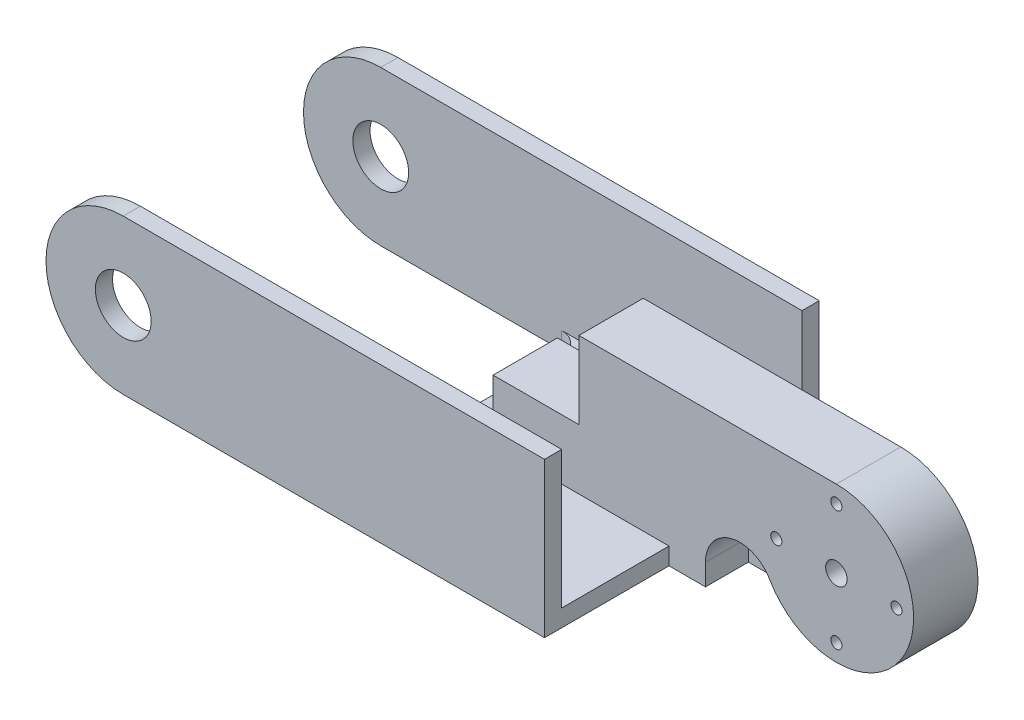
ISO-10303-21;
HEADER;
FILE_DESCRIPTION(('STEP AP214'),'2;1');
FILE_NAME('part.step','',(''),(''),'','','');
FILE_SCHEMA(('AUTOMOTIVE_DESIGN { 1 0 10303 214 1 1 1 1 }'));
ENDSEC;
DATA;
#1=APPLICATION_CONTEXT('core data for automotive mechanical design processes');
#2=APPLICATION_PROTOCOL_DEFINITION('international standard','automotive_design',2000,#1);
#3=PRODUCT_CONTEXT('',#1,'mechanical');
#4=PRODUCT('Part','Part','',(#3));
#5=PRODUCT_RELATED_PRODUCT_CATEGORY('part','',(#4));
#6=PRODUCT_DEFINITION_FORMATION('','',#4);
#7=PRODUCT_DEFINITION_CONTEXT('part definition',#1,'design');
#8=PRODUCT_DEFINITION('design','',#6,#7);
#9=PRODUCT_DEFINITION_SHAPE('','',#8);
#10=(LENGTH_UNIT() NAMED_UNIT(*) SI_UNIT(.MILLI.,.METRE.));
#11=(NAMED_UNIT(*) PLANE_ANGLE_UNIT() SI_UNIT($,.RADIAN.));
#12=(NAMED_UNIT(*) SI_UNIT($,.STERADIAN.) SOLID_ANGLE_UNIT());
#13=UNCERTAINTY_MEASURE_WITH_UNIT(LENGTH_MEASURE(1.E-05),#10,'distance_accuracy_value','');
#14=(GEOMETRIC_REPRESENTATION_CONTEXT(3) GLOBAL_UNCERTAINTY_ASSIGNED_CONTEXT((#13)) GLOBAL_UNIT_ASSIGNED_CONTEXT((#10,
#11,#12)) REPRESENTATION_CONTEXT('',''));
#15=CARTESIAN_POINT('',(0.,0.,0.));
#16=DIRECTION('',(0.,0.,1.));
#17=DIRECTION('',(1.,0.,0.));
#18=AXIS2_PLACEMENT_3D('',#15,#16,#17);
#19=CARTESIAN_POINT('',(0.,0.,4.));
#20=DIRECTION('',(-1.,0.,0.));
#21=DIRECTION('',(0.,0.,1.));
#22=AXIS2_PLACEMENT_3D('',#19,#20,#21);
#23=PLANE('',#22);
#24=DIRECTION('',(0.,1.,0.));
#25=VECTOR('',#24,1.);
#26=CARTESIAN_POINT('',(0.,0.,0.));
#27=LINE('',#26,#25);
#28=CARTESIAN_POINT('',(0.,0.,0.));
#29=VERTEX_POINT('',#28);
#30=CARTESIAN_POINT('',(0.,36.,0.));
#31=VERTEX_POINT('',#30);
#32=EDGE_CURVE('E473',#29,#31,#27,.T.);
#33=ORIENTED_EDGE('',*,*,#32,.T.);
#34=DIRECTION('',(0.,0.,-1.));
#35=VECTOR('',#34,1.);
#36=CARTESIAN_POINT('',(0.,36.,4.));
#37=LINE('',#36,#35);
#38=CARTESIAN_POINT('',(0.,36.,4.));
#39=VERTEX_POINT('',#38);
#40=EDGE_CURVE('E510',#39,#31,#37,.T.);
#41=ORIENTED_EDGE('',*,*,#40,.F.);
#42=DIRECTION('',(0.,1.,0.));
#43=VECTOR('',#42,1.);
#44=CARTESIAN_POINT('',(0.,0.,4.));
#45=LINE('',#44,#43);
#46=CARTESIAN_POINT('',(0.,4.,4.));
#47=VERTEX_POINT('',#46);
#48=EDGE_CURVE('E474',#47,#39,#45,.T.);
#49=ORIENTED_EDGE('',*,*,#48,.F.);
#50=DIRECTION('',(0.,0.,-1.));
#51=VECTOR('',#50,1.);
#52=CARTESIAN_POINT('',(0.,4.,20.));
#53=LINE('',#52,#51);
#54=CARTESIAN_POINT('',(0.,4.,20.));
#55=VERTEX_POINT('',#54);
#56=EDGE_CURVE('E470',#55,#47,#53,.T.);
#57=ORIENTED_EDGE('',*,*,#56,.F.);
#58=DIRECTION('',(0.,1.,0.));
#59=VECTOR('',#58,1.);
#60=CARTESIAN_POINT('',(0.,0.,20.));
#61=LINE('',#60,#59);
#62=CARTESIAN_POINT('',(0.,0.,20.));
#63=VERTEX_POINT('',#62);
#64=EDGE_CURVE('E450',#63,#55,#61,.T.);
#65=ORIENTED_EDGE('',*,*,#64,.F.);
#66=DIRECTION('',(0.,0.,-1.));
#67=VECTOR('',#66,1.);
#68=CARTESIAN_POINT('',(0.,0.,4.));
#69=LINE('',#68,#67);
#70=EDGE_CURVE('E487',#63,#29,#69,.T.);
#71=ORIENTED_EDGE('',*,*,#70,.T.);
#72=EDGE_LOOP('',(#33,#41,#49,#57,#65,#71));
#73=FACE_BOUND('',#72,.T.);
#74=ADVANCED_FACE('F50',(#73),#23,.F.);
#75=CARTESIAN_POINT('',(0.,36.,4.));
#76=DIRECTION('',(0.,-1.,0.));
#77=DIRECTION('',(0.,0.,-1.));
#78=AXIS2_PLACEMENT_3D('',#75,#76,#77);
#79=PLANE('',#78);
#80=DIRECTION('',(-1.,0.,0.));
#81=VECTOR('',#80,1.);
#82=CARTESIAN_POINT('',(0.,36.,0.));
#83=LINE('',#82,#81);
#84=CARTESIAN_POINT('',(-98.17,36.,0.));
#85=VERTEX_POINT('',#84);
#86=EDGE_CURVE('E491',#31,#85,#83,.T.);
#87=ORIENTED_EDGE('',*,*,#86,.T.);
#88=DIRECTION('',(0.,0.,-1.));
#89=VECTOR('',#88,1.);
#90=CARTESIAN_POINT('',(-98.17,36.,4.));
#91=LINE('',#90,#89);
#92=CARTESIAN_POINT('',(-98.17,36.,4.));
#93=VERTEX_POINT('',#92);
#94=EDGE_CURVE('E506',#93,#85,#91,.T.);
#95=ORIENTED_EDGE('',*,*,#94,.F.);
#96=DIRECTION('',(-1.,0.,0.));
#97=VECTOR('',#96,1.);
#98=CARTESIAN_POINT('',(0.,36.,4.));
#99=LINE('',#98,#97);
#100=EDGE_CURVE('E477',#39,#93,#99,.T.);
#101=ORIENTED_EDGE('',*,*,#100,.F.);
#102=ORIENTED_EDGE('',*,*,#40,.T.);
#103=EDGE_LOOP('',(#87,#95,#101,#102));
#104=FACE_BOUND('',#103,.T.);
#105=ADVANCED_FACE('F628',(#104),#79,.F.);
#106=CARTESIAN_POINT('',(-98.17,18.,4.));
#107=DIRECTION('',(0.,0.,-1.));
#108=DIRECTION('',(-1.,0.,0.));
#109=AXIS2_PLACEMENT_3D('',#106,#107,#108);
#110=CYLINDRICAL_SURFACE('',#109,18.);
#111=CARTESIAN_POINT('',(-98.17,18.,0.));
#112=DIRECTION('',(0.,0.,1.));
#113=DIRECTION('',(1.,0.,0.));
#114=AXIS2_PLACEMENT_3D('',#111,#112,#113);
#115=CIRCLE('',#114,18.);
#116=CARTESIAN_POINT('',(-98.17,0.,0.));
#117=VERTEX_POINT('',#116);
#118=EDGE_CURVE('E494',#85,#117,#115,.T.);
#119=ORIENTED_EDGE('',*,*,#118,.T.);
#120=DIRECTION('',(0.,0.,-1.));
#121=VECTOR('',#120,1.);
#122=CARTESIAN_POINT('',(-98.17,0.,4.));
#123=LINE('',#122,#121);
#124=CARTESIAN_POINT('',(-98.17,0.,4.));
#125=VERTEX_POINT('',#124);
#126=EDGE_CURVE('E502',#125,#117,#123,.T.);
#127=ORIENTED_EDGE('',*,*,#126,.F.);
#128=CARTESIAN_POINT('',(-98.17,18.,4.));
#129=DIRECTION('',(0.,0.,1.));
#130=DIRECTION('',(1.,0.,0.));
#131=AXIS2_PLACEMENT_3D('',#128,#129,#130);
#132=CIRCLE('',#131,18.);
#133=EDGE_CURVE('E481',#93,#125,#132,.T.);
#134=ORIENTED_EDGE('',*,*,#133,.F.);
#135=ORIENTED_EDGE('',*,*,#94,.T.);
#136=EDGE_LOOP('',(#119,#127,#134,#135));
#137=FACE_BOUND('',#136,.T.);
#138=ADVANCED_FACE('F633',(#137),#110,.T.);
#139=CARTESIAN_POINT('',(0.,0.,4.));
#140=DIRECTION('',(0.,1.,0.));
#141=DIRECTION('',(0.,0.,1.));
#142=AXIS2_PLACEMENT_3D('',#139,#140,#141);
#143=PLANE('',#142);
#144=DIRECTION('',(1.,0.,0.));
#145=VECTOR('',#144,1.);
#146=CARTESIAN_POINT('',(0.,0.,0.));
#147=LINE('',#146,#145);
#148=EDGE_CURVE('E478',#117,#29,#147,.T.);
#149=ORIENTED_EDGE('',*,*,#148,.T.);
#150=ORIENTED_EDGE('',*,*,#70,.F.);
#151=DIRECTION('',(1.,0.,0.));
#152=VECTOR('',#151,1.);
#153=CARTESIAN_POINT('',(0.,0.,20.));
#154=LINE('',#153,#152);
#155=CARTESIAN_POINT('',(-51.,0.,20.));
#156=VERTEX_POINT('',#155);
#157=EDGE_CURVE('E457',#156,#63,#154,.T.);
#158=ORIENTED_EDGE('',*,*,#157,.F.);
#159=DIRECTION('',(0.,0.,-1.));
#160=VECTOR('',#159,1.);
#161=CARTESIAN_POINT('',(-51.,0.,20.));
#162=LINE('',#161,#160);
#163=CARTESIAN_POINT('',(-51.,0.,9.));
#164=VERTEX_POINT('',#163);
#165=EDGE_CURVE('E461',#156,#164,#162,.T.);
#166=ORIENTED_EDGE('',*,*,#165,.T.);
#167=CARTESIAN_POINT('',(-56.,0.,9.));
#168=DIRECTION('',(0.,1.,0.));
#169=DIRECTION('',(0.,0.,1.));
#170=AXIS2_PLACEMENT_3D('',#167,#168,#169);
#171=CIRCLE('',#170,5.);
#172=CARTESIAN_POINT('',(-56.,0.,4.));
#173=VERTEX_POINT('',#172);
#174=EDGE_CURVE('E59',#164,#173,#171,.T.);
#175=ORIENTED_EDGE('',*,*,#174,.T.);
#176=DIRECTION('',(1.,0.,0.));
#177=VECTOR('',#176,1.);
#178=CARTESIAN_POINT('',(0.,0.,4.));
#179=LINE('',#178,#177);
#180=EDGE_CURVE('E484',#125,#173,#179,.T.);
#181=ORIENTED_EDGE('',*,*,#180,.F.);
#182=ORIENTED_EDGE('',*,*,#126,.T.);
#183=EDGE_LOOP('',(#149,#150,#158,#166,#175,#181,#182));
#184=FACE_BOUND('',#183,.T.);
#185=ADVANCED_FACE('F602',(#184),#143,.F.);
#186=CARTESIAN_POINT('',(-98.17,18.,4.));
#187=DIRECTION('',(0.,0.,1.));
#188=DIRECTION('',(1.,0.,0.));
#189=AXIS2_PLACEMENT_3D('',#186,#187,#188);
#190=PLANE('',#189);
#191=CARTESIAN_POINT('',(-98.17,18.,4.));
#192=DIRECTION('',(0.,0.,1.));
#193=DIRECTION('',(1.,0.,0.));
#194=AXIS2_PLACEMENT_3D('',#191,#192,#193);
#195=CIRCLE('',#194,6.5);
#196=CARTESIAN_POINT('',(-91.67,18.,4.));
#197=VERTEX_POINT('',#196);
#198=EDGE_CURVE('E318',#197,#197,#195,.T.);
#199=ORIENTED_EDGE('',*,*,#198,.F.);
#200=EDGE_LOOP('',(#199));
#201=FACE_BOUND('',#200,.T.);
#202=ORIENTED_EDGE('',*,*,#180,.T.);
#203=DIRECTION('',(0.,-1.,0.));
#204=VECTOR('',#203,1.);
#205=CARTESIAN_POINT('',(-56.,18.,4.));
#206=LINE('',#205,#204);
#207=CARTESIAN_POINT('',(-56.,4.,4.));
#208=VERTEX_POINT('',#207);
#209=EDGE_CURVE('E525',#173,#208,#206,.F.);
#210=ORIENTED_EDGE('',*,*,#209,.T.);
#211=DIRECTION('',(-1.,0.,0.));
#212=VECTOR('',#211,1.);
#213=CARTESIAN_POINT('',(0.,4.,4.));
#214=LINE('',#213,#212);
#215=EDGE_CURVE('E65',#47,#208,#214,.T.);
#216=ORIENTED_EDGE('',*,*,#215,.F.);
#217=ORIENTED_EDGE('',*,*,#48,.T.);
#218=ORIENTED_EDGE('',*,*,#100,.T.);
#219=ORIENTED_EDGE('',*,*,#133,.T.);
#220=EDGE_LOOP('',(#202,#210,#216,#217,#218,#219));
#221=FACE_BOUND('',#220,.T.);
#222=ADVANCED_FACE('F725',(#201,#221),#190,.T.);
#223=CARTESIAN_POINT('',(-98.17,18.,0.));
#224=DIRECTION('',(0.,0.,1.));
#225=DIRECTION('',(1.,0.,0.));
#226=AXIS2_PLACEMENT_3D('',#223,#224,#225);
#227=PLANE('',#226);
#228=CARTESIAN_POINT('',(-98.17,18.,0.));
#229=DIRECTION('',(0.,0.,1.));
#230=DIRECTION('',(1.,0.,0.));
#231=AXIS2_PLACEMENT_3D('',#228,#229,#230);
#232=CIRCLE('',#231,6.5);
#233=CARTESIAN_POINT('',(-91.67,18.,0.));
#234=VERTEX_POINT('',#233);
#235=EDGE_CURVE('E307',#234,#234,#232,.T.);
#236=ORIENTED_EDGE('',*,*,#235,.T.);
#237=EDGE_LOOP('',(#236));
#238=FACE_BOUND('',#237,.T.);
#239=ORIENTED_EDGE('',*,*,#32,.F.);
#240=ORIENTED_EDGE('',*,*,#148,.F.);
#241=ORIENTED_EDGE('',*,*,#118,.F.);
#242=ORIENTED_EDGE('',*,*,#86,.F.);
#243=EDGE_LOOP('',(#239,#240,#241,#242));
#244=FACE_BOUND('',#243,.T.);
#245=ADVANCED_FACE('F721',(#238,#244),#227,.F.);
#246=CARTESIAN_POINT('',(0.,4.,20.));
#247=DIRECTION('',(0.,-1.,0.));
#248=DIRECTION('',(0.,0.,-1.));
#249=AXIS2_PLACEMENT_3D('',#246,#247,#248);
#250=PLANE('',#249);
#251=ORIENTED_EDGE('',*,*,#215,.T.);
#252=CARTESIAN_POINT('',(-56.,4.,9.));
#253=DIRECTION('',(0.,-1.,0.));
#254=DIRECTION('',(0.,0.,-1.));
#255=AXIS2_PLACEMENT_3D('',#252,#253,#254);
#256=CIRCLE('',#255,5.);
#257=CARTESIAN_POINT('',(-51.,4.,9.));
#258=VERTEX_POINT('',#257);
#259=EDGE_CURVE('E11',#208,#258,#256,.T.);
#260=ORIENTED_EDGE('',*,*,#259,.T.);
#261=DIRECTION('',(0.,0.,-1.));
#262=VECTOR('',#261,1.);
#263=CARTESIAN_POINT('',(-51.,4.,20.));
#264=LINE('',#263,#262);
#265=CARTESIAN_POINT('',(-51.,4.,55.));
#266=VERTEX_POINT('',#265);
#267=EDGE_CURVE('E466',#266,#258,#264,.T.);
#268=ORIENTED_EDGE('',*,*,#267,.F.);
#269=CARTESIAN_POINT('',(-56.,4.,55.));
#270=DIRECTION('',(0.,-1.,0.));
#271=DIRECTION('',(0.,0.,-1.));
#272=AXIS2_PLACEMENT_3D('',#269,#270,#271);
#273=CIRCLE('',#272,5.);
#274=CARTESIAN_POINT('',(-56.,4.,60.));
#275=VERTEX_POINT('',#274);
#276=EDGE_CURVE('E531',#266,#275,#273,.T.);
#277=ORIENTED_EDGE('',*,*,#276,.T.);
#278=DIRECTION('',(-1.,0.,0.));
#279=VECTOR('',#278,1.);
#280=CARTESIAN_POINT('',(0.,4.,60.));
#281=LINE('',#280,#279);
#282=CARTESIAN_POINT('',(0.,4.,60.));
#283=VERTEX_POINT('',#282);
#284=EDGE_CURVE('E362',#283,#275,#281,.T.);
#285=ORIENTED_EDGE('',*,*,#284,.F.);
#286=DIRECTION('',(0.,0.,-1.));
#287=VECTOR('',#286,1.);
#288=CARTESIAN_POINT('',(0.,4.,60.));
#289=LINE('',#288,#287);
#290=CARTESIAN_POINT('',(0.,4.,35.));
#291=VERTEX_POINT('',#290);
#292=EDGE_CURVE('E376',#283,#291,#289,.T.);
#293=ORIENTED_EDGE('',*,*,#292,.T.);
#294=DIRECTION('',(-1.,0.,0.));
#295=VECTOR('',#294,1.);
#296=CARTESIAN_POINT('',(0.,4.,35.));
#297=LINE('',#296,#295);
#298=CARTESIAN_POINT('',(-41.,4.,35.));
#299=VERTEX_POINT('',#298);
#300=EDGE_CURVE('E366',#291,#299,#297,.T.);
#301=ORIENTED_EDGE('',*,*,#300,.T.);
#302=DIRECTION('',(0.,0.,-1.));
#303=VECTOR('',#302,1.);
#304=CARTESIAN_POINT('',(-41.,4.,35.));
#305=LINE('',#304,#303);
#306=CARTESIAN_POINT('',(-41.,4.,20.));
#307=VERTEX_POINT('',#306);
#308=EDGE_CURVE('E446',#299,#307,#305,.T.);
#309=ORIENTED_EDGE('',*,*,#308,.T.);
#310=DIRECTION('',(-1.,0.,0.));
#311=VECTOR('',#310,1.);
#312=CARTESIAN_POINT('',(0.,4.,20.));
#313=LINE('',#312,#311);
#314=EDGE_CURVE('E454',#55,#307,#313,.T.);
#315=ORIENTED_EDGE('',*,*,#314,.F.);
#316=ORIENTED_EDGE('',*,*,#56,.T.);
#317=EDGE_LOOP('',(#251,#260,#268,#277,#285,#293,#301,#309,#315,#316));
#318=FACE_BOUND('',#317,.T.);
#319=ADVANCED_FACE('F610',(#318),#250,.F.);
#320=CARTESIAN_POINT('',(-51.,0.,20.));
#321=DIRECTION('',(1.,0.,0.));
#322=DIRECTION('',(0.,0.,-1.));
#323=AXIS2_PLACEMENT_3D('',#320,#321,#322);
#324=PLANE('',#323);
#325=DIRECTION('',(0.,0.,-1.));
#326=VECTOR('',#325,1.);
#327=CARTESIAN_POINT('',(-51.,0.,35.));
#328=LINE('',#327,#326);
#329=CARTESIAN_POINT('',(-51.,0.,55.));
#330=VERTEX_POINT('',#329);
#331=EDGE_CURVE('E443',#330,#156,#328,.T.);
#332=ORIENTED_EDGE('',*,*,#331,.F.);
#333=DIRECTION('',(0.,-1.,0.));
#334=VECTOR('',#333,1.);
#335=CARTESIAN_POINT('',(-51.,4.,55.));
#336=LINE('',#335,#334);
#337=EDGE_CURVE('E522',#330,#266,#336,.F.);
#338=ORIENTED_EDGE('',*,*,#337,.T.);
#339=ORIENTED_EDGE('',*,*,#267,.T.);
#340=DIRECTION('',(0.,-1.,0.));
#341=VECTOR('',#340,1.);
#342=CARTESIAN_POINT('',(-51.,0.,9.));
#343=LINE('',#342,#341);
#344=EDGE_CURVE('E518',#258,#164,#343,.T.);
#345=ORIENTED_EDGE('',*,*,#344,.T.);
#346=ORIENTED_EDGE('',*,*,#165,.F.);
#347=EDGE_LOOP('',(#332,#338,#339,#345,#346));
#348=FACE_BOUND('',#347,.T.);
#349=ADVANCED_FACE('F599',(#348),#324,.F.);
#350=CARTESIAN_POINT('',(0.,0.,20.));
#351=DIRECTION('',(0.,0.,1.));
#352=DIRECTION('',(1.,0.,0.));
#353=AXIS2_PLACEMENT_3D('',#350,#351,#352);
#354=PLANE('',#353);
#355=CARTESIAN_POINT('',(39.,18.,20.));
#356=DIRECTION('',(0.,0.,1.));
#357=DIRECTION('',(1.,0.,0.));
#358=AXIS2_PLACEMENT_3D('',#355,#356,#357);
#359=CIRCLE('',#358,2.5);
#360=CARTESIAN_POINT('',(41.5,18.,20.));
#361=VERTEX_POINT('',#360);
#362=EDGE_CURVE('E302',#361,#361,#359,.T.);
#363=ORIENTED_EDGE('',*,*,#362,.T.);
#364=EDGE_LOOP('',(#363));
#365=FACE_BOUND('',#364,.T.);
#366=DIRECTION('',(0.999999999999998,6.85427510763005E-08,0.));
#367=VECTOR('',#366,1.);
#368=CARTESIAN_POINT('',(-2.40326847280963E-13,3.50623287666751E-06,20.));
#369=LINE('',#368,#367);
#370=CARTESIAN_POINT('',(39.0000000000002,6.17940016864327E-06,20.));
#371=VERTEX_POINT('',#370);
#372=EDGE_CURVE('E408',#63,#371,#369,.T.);
#373=ORIENTED_EDGE('',*,*,#372,.F.);
#374=ORIENTED_EDGE('',*,*,#64,.T.);
#375=ORIENTED_EDGE('',*,*,#314,.T.);
#376=DIRECTION('',(0.,1.,0.));
#377=VECTOR('',#376,1.);
#378=CARTESIAN_POINT('',(-41.,0.,20.));
#379=LINE('',#378,#377);
#380=CARTESIAN_POINT('',(-41.,18.0000000105526,20.));
#381=VERTEX_POINT('',#380);
#382=EDGE_CURVE('E380',#307,#381,#379,.T.);
#383=ORIENTED_EDGE('',*,*,#382,.T.);
#384=DIRECTION('',(-1.,0.,0.));
#385=VECTOR('',#384,1.);
#386=CARTESIAN_POINT('',(0.,18.0000000105526,20.));
#387=LINE('',#386,#385);
#388=CARTESIAN_POINT('',(-21.,18.0000000105526,20.));
#389=VERTEX_POINT('',#388);
#390=EDGE_CURVE('E386',#389,#381,#387,.T.);
#391=ORIENTED_EDGE('',*,*,#390,.F.);
#392=DIRECTION('',(0.,1.,0.));
#393=VECTOR('',#392,1.);
#394=CARTESIAN_POINT('',(-21.,0.,20.));
#395=LINE('',#394,#393);
#396=CARTESIAN_POINT('',(-21.,36.000000010551,20.));
#397=VERTEX_POINT('',#396);
#398=EDGE_CURVE('E420',#389,#397,#395,.T.);
#399=ORIENTED_EDGE('',*,*,#398,.T.);
#400=DIRECTION('',(0.999999999999995,-1.03165851154048E-07,0.));
#401=VECTOR('',#400,1.);
#402=CARTESIAN_POINT('',(3.71397041912716E-06,35.9999978440677,20.));
#403=LINE('',#402,#401);
#404=CARTESIAN_POINT('',(39.0000028568994,35.9999938205996,20.));
#405=VERTEX_POINT('',#404);
#406=EDGE_CURVE('E416',#397,#405,#403,.T.);
#407=ORIENTED_EDGE('',*,*,#406,.T.);
#408=CARTESIAN_POINT('',(39.,18.,20.));
#409=DIRECTION('',(0.,0.,1.));
#410=DIRECTION('',(1.,0.,0.));
#411=AXIS2_PLACEMENT_3D('',#408,#409,#410);
#412=CIRCLE('',#411,17.9999938205998);
#413=EDGE_CURVE('E412',#371,#405,#412,.T.);
#414=ORIENTED_EDGE('',*,*,#413,.F.);
#415=EDGE_LOOP('',(#373,#374,#375,#383,#391,#399,#407,#414));
#416=FACE_BOUND('',#415,.T.);
#417=ADVANCED_FACE('F548',(#365,#416),#354,.F.);
#418=CARTESIAN_POINT('',(-41.,0.,35.));
#419=DIRECTION('',(-1.,0.,0.));
#420=DIRECTION('',(0.,0.,1.));
#421=AXIS2_PLACEMENT_3D('',#418,#419,#420);
#422=PLANE('',#421);
#423=ORIENTED_EDGE('',*,*,#382,.F.);
#424=ORIENTED_EDGE('',*,*,#308,.F.);
#425=DIRECTION('',(0.,1.,0.));
#426=VECTOR('',#425,1.);
#427=CARTESIAN_POINT('',(-41.,0.,35.));
#428=LINE('',#427,#426);
#429=CARTESIAN_POINT('',(-41.,18.0000000105526,35.));
#430=VERTEX_POINT('',#429);
#431=EDGE_CURVE('E381',#299,#430,#428,.T.);
#432=ORIENTED_EDGE('',*,*,#431,.T.);
#433=DIRECTION('',(0.,0.,-1.));
#434=VECTOR('',#433,1.);
#435=CARTESIAN_POINT('',(-41.,18.0000000105526,35.));
#436=LINE('',#435,#434);
#437=EDGE_CURVE('E404',#430,#381,#436,.T.);
#438=ORIENTED_EDGE('',*,*,#437,.T.);
#439=EDGE_LOOP('',(#423,#424,#432,#438));
#440=FACE_BOUND('',#439,.T.);
#441=ADVANCED_FACE('F612',(#440),#422,.T.);
#442=CARTESIAN_POINT('',(-2.40326847280963E-13,3.50623287666751E-06,35.));
#443=DIRECTION('',(-6.85427510763005E-08,0.999999999999998,0.));
#444=DIRECTION('',(-0.999999999999998,-6.85427510763005E-08,0.));
#445=AXIS2_PLACEMENT_3D('',#442,#443,#444);
#446=PLANE('',#445);
#447=DIRECTION('',(0.999999999999979,2.02594923104912E-07,0.));
#448=VECTOR('',#447,1.);
#449=CARTESIAN_POINT('',(8.49874126192618,0.,25.));
#450=LINE('',#449,#448);
#451=CARTESIAN_POINT('',(8.49874126192618,0.,25.));
#452=VERTEX_POINT('',#451);
#453=CARTESIAN_POINT('',(39.0000000000002,6.17940016864327E-06,25.));
#454=VERTEX_POINT('',#453);
#455=EDGE_CURVE('E272',#452,#454,#450,.T.);
#456=ORIENTED_EDGE('',*,*,#455,.F.);
#457=DIRECTION('',(0.,0.,1.));
#458=VECTOR('',#457,1.);
#459=CARTESIAN_POINT('',(8.49874126192618,0.,25.));
#460=LINE('',#459,#458);
#461=CARTESIAN_POINT('',(8.49874126192618,0.,35.));
#462=VERTEX_POINT('',#461);
#463=EDGE_CURVE('E292',#452,#462,#460,.T.);
#464=ORIENTED_EDGE('',*,*,#463,.T.);
#465=DIRECTION('',(0.999999999999998,6.85427510763005E-08,0.));
#466=VECTOR('',#465,1.);
#467=CARTESIAN_POINT('',(-2.40326847280963E-13,3.50623287666751E-06,35.));
#468=LINE('',#467,#466);
#469=CARTESIAN_POINT('',(0.,0.,35.));
#470=VERTEX_POINT('',#469);
#471=EDGE_CURVE('E385',#470,#462,#468,.T.);
#472=ORIENTED_EDGE('',*,*,#471,.F.);
#473=DIRECTION('',(0.,0.,-1.));
#474=VECTOR('',#473,1.);
#475=CARTESIAN_POINT('',(0.,0.,60.));
#476=LINE('',#475,#474);
#477=CARTESIAN_POINT('',(0.,0.,64.));
#478=VERTEX_POINT('',#477);
#479=EDGE_CURVE('E365',#478,#470,#476,.T.);
#480=ORIENTED_EDGE('',*,*,#479,.F.);
#481=DIRECTION('',(1.,0.,0.));
#482=VECTOR('',#481,1.);
#483=CARTESIAN_POINT('',(0.,0.,64.));
#484=LINE('',#483,#482);
#485=CARTESIAN_POINT('',(-98.17,0.,64.));
#486=VERTEX_POINT('',#485);
#487=EDGE_CURVE('E334',#486,#478,#484,.T.);
#488=ORIENTED_EDGE('',*,*,#487,.F.);
#489=DIRECTION('',(0.,0.,-1.));
#490=VECTOR('',#489,1.);
#491=CARTESIAN_POINT('',(-98.17,0.,64.));
#492=LINE('',#491,#490);
#493=CARTESIAN_POINT('',(-98.17,0.,60.));
#494=VERTEX_POINT('',#493);
#495=EDGE_CURVE('E338',#486,#494,#492,.T.);
#496=ORIENTED_EDGE('',*,*,#495,.T.);
#497=DIRECTION('',(1.,0.,0.));
#498=VECTOR('',#497,1.);
#499=CARTESIAN_POINT('',(0.,0.,60.));
#500=LINE('',#499,#498);
#501=CARTESIAN_POINT('',(-56.,0.,60.));
#502=VERTEX_POINT('',#501);
#503=EDGE_CURVE('E328',#494,#502,#500,.T.);
#504=ORIENTED_EDGE('',*,*,#503,.T.);
#505=CARTESIAN_POINT('',(-56.,-3.32161183974611E-07,55.));
#506=DIRECTION('',(-6.85427510763005E-08,0.999999999999998,0.));
#507=DIRECTION('',(-0.999999999999998,-6.85427510763005E-08,0.));
#508=AXIS2_PLACEMENT_3D('',#505,#506,#507);
#509=CIRCLE('',#508,5.);
#510=EDGE_CURVE('E528',#502,#330,#509,.T.);
#511=ORIENTED_EDGE('',*,*,#510,.T.);
#512=ORIENTED_EDGE('',*,*,#331,.T.);
#513=ORIENTED_EDGE('',*,*,#157,.T.);
#514=ORIENTED_EDGE('',*,*,#372,.T.);
#515=DIRECTION('',(0.,0.,-1.));
#516=VECTOR('',#515,1.);
#517=CARTESIAN_POINT('',(39.0000000000002,6.17940016864327E-06,35.));
#518=LINE('',#517,#516);
#519=EDGE_CURVE('E438',#454,#371,#518,.T.);
#520=ORIENTED_EDGE('',*,*,#519,.F.);
#521=EDGE_LOOP('',(#456,#464,#472,#480,#488,#496,#504,#511,#512,#513,#514,#520));
#522=FACE_BOUND('',#521,.T.);
#523=ADVANCED_FACE('F545',(#522),#446,.F.);
#524=CARTESIAN_POINT('',(39.,18.,35.));
#525=DIRECTION('',(0.,0.,-1.));
#526=DIRECTION('',(-1.,0.,0.));
#527=AXIS2_PLACEMENT_3D('',#524,#525,#526);
#528=CYLINDRICAL_SURFACE('',#527,17.9999938205998);
#529=ORIENTED_EDGE('',*,*,#413,.T.);
#530=DIRECTION('',(0.,0.,-1.));
#531=VECTOR('',#530,1.);
#532=CARTESIAN_POINT('',(39.0000028568994,35.9999938205996,35.));
#533=LINE('',#532,#531);
#534=CARTESIAN_POINT('',(39.0000028568994,35.9999938205996,35.));
#535=VERTEX_POINT('',#534);
#536=EDGE_CURVE('E435',#535,#405,#533,.T.);
#537=ORIENTED_EDGE('',*,*,#536,.F.);
#538=CARTESIAN_POINT('',(39.,18.,35.));
#539=DIRECTION('',(0.,0.,1.));
#540=DIRECTION('',(1.,0.,0.));
#541=AXIS2_PLACEMENT_3D('',#538,#539,#540);
#542=CIRCLE('',#541,17.9999938205998);
#543=CARTESIAN_POINT('',(39.0000000000002,6.17940016864327E-06,35.));
#544=VERTEX_POINT('',#543);
#545=EDGE_CURVE('E390',#544,#535,#542,.T.);
#546=ORIENTED_EDGE('',*,*,#545,.F.);
#547=EDGE_CURVE('E439',#544,#454,#518,.T.);
#548=ORIENTED_EDGE('',*,*,#547,.T.);
#549=ORIENTED_EDGE('',*,*,#519,.T.);
#550=EDGE_LOOP('',(#529,#537,#546,#548,#549));
#551=FACE_BOUND('',#550,.T.);
#552=ADVANCED_FACE('F538',(#551),#528,.T.);
#553=CARTESIAN_POINT('',(3.71397041912716E-06,35.9999978440677,35.));
#554=DIRECTION('',(1.03165851154048E-07,0.999999999999995,0.));
#555=DIRECTION('',(-0.999999999999995,1.03165851154048E-07,0.));
#556=AXIS2_PLACEMENT_3D('',#553,#554,#555);
#557=PLANE('',#556);
#558=ORIENTED_EDGE('',*,*,#406,.F.);
#559=DIRECTION('',(0.,0.,-1.));
#560=VECTOR('',#559,1.);
#561=CARTESIAN_POINT('',(-21.,36.000000010551,35.));
#562=LINE('',#561,#560);
#563=CARTESIAN_POINT('',(-21.,36.000000010551,35.));
#564=VERTEX_POINT('',#563);
#565=EDGE_CURVE('E432',#564,#397,#562,.T.);
#566=ORIENTED_EDGE('',*,*,#565,.F.);
#567=DIRECTION('',(0.999999999999995,-1.03165851154048E-07,0.));
#568=VECTOR('',#567,1.);
#569=CARTESIAN_POINT('',(3.71397041912716E-06,35.9999978440677,35.));
#570=LINE('',#569,#568);
#571=EDGE_CURVE('E393',#564,#535,#570,.T.);
#572=ORIENTED_EDGE('',*,*,#571,.T.);
#573=ORIENTED_EDGE('',*,*,#536,.T.);
#574=EDGE_LOOP('',(#558,#566,#572,#573));
#575=FACE_BOUND('',#574,.T.);
#576=ADVANCED_FACE('F553',(#575),#557,.T.);
#577=CARTESIAN_POINT('',(-21.,0.,35.));
#578=DIRECTION('',(-1.,0.,0.));
#579=DIRECTION('',(0.,0.,1.));
#580=AXIS2_PLACEMENT_3D('',#577,#578,#579);
#581=PLANE('',#580);
#582=ORIENTED_EDGE('',*,*,#398,.F.);
#583=DIRECTION('',(0.,0.,-1.));
#584=VECTOR('',#583,1.);
#585=CARTESIAN_POINT('',(-21.,18.0000000105526,35.));
#586=LINE('',#585,#584);
#587=CARTESIAN_POINT('',(-21.,18.0000000105526,35.));
#588=VERTEX_POINT('',#587);
#589=EDGE_CURVE('E429',#588,#389,#586,.T.);
#590=ORIENTED_EDGE('',*,*,#589,.F.);
#591=DIRECTION('',(0.,1.,0.));
#592=VECTOR('',#591,1.);
#593=CARTESIAN_POINT('',(-21.,0.,35.));
#594=LINE('',#593,#592);
#595=EDGE_CURVE('E397',#588,#564,#594,.T.);
#596=ORIENTED_EDGE('',*,*,#595,.T.);
#597=ORIENTED_EDGE('',*,*,#565,.T.);
#598=EDGE_LOOP('',(#582,#590,#596,#597));
#599=FACE_BOUND('',#598,.T.);
#600=ADVANCED_FACE('F618',(#599),#581,.T.);
#601=CARTESIAN_POINT('',(0.,18.0000000105526,35.));
#602=DIRECTION('',(0.,-1.,0.));
#603=DIRECTION('',(0.,0.,-1.));
#604=AXIS2_PLACEMENT_3D('',#601,#602,#603);
#605=PLANE('',#604);
#606=ORIENTED_EDGE('',*,*,#390,.T.);
#607=ORIENTED_EDGE('',*,*,#437,.F.);
#608=DIRECTION('',(-1.,0.,0.));
#609=VECTOR('',#608,1.);
#610=CARTESIAN_POINT('',(0.,18.0000000105526,35.));
#611=LINE('',#610,#609);
#612=EDGE_CURVE('E401',#588,#430,#611,.T.);
#613=ORIENTED_EDGE('',*,*,#612,.F.);
#614=ORIENTED_EDGE('',*,*,#589,.T.);
#615=EDGE_LOOP('',(#606,#607,#613,#614));
#616=FACE_BOUND('',#615,.T.);
#617=ADVANCED_FACE('F616',(#616),#605,.F.);
#618=CARTESIAN_POINT('',(0.,0.,35.));
#619=DIRECTION('',(0.,0.,1.));
#620=DIRECTION('',(1.,0.,0.));
#621=AXIS2_PLACEMENT_3D('',#618,#619,#620);
#622=PLANE('',#621);
#623=CARTESIAN_POINT('',(39.,32.,35.));
#624=DIRECTION('',(0.,0.,1.));
#625=DIRECTION('',(1.,0.,0.));
#626=AXIS2_PLACEMENT_3D('',#623,#624,#625);
#627=CIRCLE('',#626,1.29999999999999);
#628=CARTESIAN_POINT('',(40.3,32.,35.));
#629=VERTEX_POINT('',#628);
#630=EDGE_CURVE('E233',#629,#629,#627,.T.);
#631=ORIENTED_EDGE('',*,*,#630,.F.);
#632=EDGE_LOOP('',(#631));
#633=FACE_BOUND('',#632,.T.);
#634=CARTESIAN_POINT('',(25.,18.,35.));
#635=DIRECTION('',(0.,0.,1.));
#636=DIRECTION('',(1.,0.,0.));
#637=AXIS2_PLACEMENT_3D('',#634,#635,#636);
#638=CIRCLE('',#637,1.29999999999999);
#639=CARTESIAN_POINT('',(26.3,18.,35.));
#640=VERTEX_POINT('',#639);
#641=EDGE_CURVE('E232',#640,#640,#638,.T.);
#642=ORIENTED_EDGE('',*,*,#641,.F.);
#643=EDGE_LOOP('',(#642));
#644=FACE_BOUND('',#643,.T.);
#645=CARTESIAN_POINT('',(39.,4.,35.));
#646=DIRECTION('',(0.,0.,1.));
#647=DIRECTION('',(1.,0.,0.));
#648=AXIS2_PLACEMENT_3D('',#645,#646,#647);
#649=CIRCLE('',#648,1.29999999999999);
#650=CARTESIAN_POINT('',(40.3,4.,35.));
#651=VERTEX_POINT('',#650);
#652=EDGE_CURVE('E246',#651,#651,#649,.T.);
#653=ORIENTED_EDGE('',*,*,#652,.F.);
#654=EDGE_LOOP('',(#653));
#655=FACE_BOUND('',#654,.T.);
#656=CARTESIAN_POINT('',(53.,18.,35.));
#657=DIRECTION('',(0.,0.,1.));
#658=DIRECTION('',(1.,0.,0.));
#659=AXIS2_PLACEMENT_3D('',#656,#657,#658);
#660=CIRCLE('',#659,1.29999999999999);
#661=CARTESIAN_POINT('',(54.3,18.,35.));
#662=VERTEX_POINT('',#661);
#663=EDGE_CURVE('E254',#662,#662,#660,.T.);
#664=ORIENTED_EDGE('',*,*,#663,.F.);
#665=EDGE_LOOP('',(#664));
#666=FACE_BOUND('',#665,.T.);
#667=CARTESIAN_POINT('',(39.0212619462908,17.9999936218858,35.));
#668=DIRECTION('',(0.,0.,-1.));
#669=DIRECTION('',(1.,0.,0.));
#670=AXIS2_PLACEMENT_3D('',#667,#668,#669);
#671=CIRCLE('',#670,18.);
#672=CARTESIAN_POINT('',(23.4487636141151,8.97240835812981,35.));
#673=VERTEX_POINT('',#672);
#674=EDGE_CURVE('E268',#544,#673,#671,.T.);
#675=ORIENTED_EDGE('',*,*,#674,.F.);
#676=ORIENTED_EDGE('',*,*,#545,.T.);
#677=ORIENTED_EDGE('',*,*,#571,.F.);
#678=ORIENTED_EDGE('',*,*,#595,.F.);
#679=ORIENTED_EDGE('',*,*,#612,.T.);
#680=ORIENTED_EDGE('',*,*,#431,.F.);
#681=ORIENTED_EDGE('',*,*,#300,.F.);
#682=DIRECTION('',(0.,1.,0.));
#683=VECTOR('',#682,1.);
#684=CARTESIAN_POINT('',(0.,0.,35.));
#685=LINE('',#684,#683);
#686=EDGE_CURVE('E361',#470,#291,#685,.T.);
#687=ORIENTED_EDGE('',*,*,#686,.F.);
#688=ORIENTED_EDGE('',*,*,#471,.T.);
#689=DIRECTION('',(0.,-1.,0.));
#690=VECTOR('',#689,1.);
#691=CARTESIAN_POINT('',(8.49874126192618,4.97337212193862,35.));
#692=LINE('',#691,#690);
#693=CARTESIAN_POINT('',(8.49874126192618,4.97337212193862,35.));
#694=VERTEX_POINT('',#693);
#695=EDGE_CURVE('E282',#694,#462,#692,.T.);
#696=ORIENTED_EDGE('',*,*,#695,.F.);
#697=CARTESIAN_POINT('',(16.4986546771852,5.01059239006577,35.));
#698=DIRECTION('',(0.,0.,1.));
#699=DIRECTION('',(1.,0.,0.));
#700=AXIS2_PLACEMENT_3D('',#697,#698,#699);
#701=CIRCLE('',#700,8.);
#702=EDGE_CURVE('E262',#673,#694,#701,.T.);
#703=ORIENTED_EDGE('',*,*,#702,.F.);
#704=EDGE_LOOP('',(#675,#676,#677,#678,#679,#680,#681,#687,#688,#696,#703));
#705=FACE_BOUND('',#704,.T.);
#706=CARTESIAN_POINT('',(39.,18.,35.));
#707=DIRECTION('',(0.,0.,1.));
#708=DIRECTION('',(1.,0.,0.));
#709=AXIS2_PLACEMENT_3D('',#706,#707,#708);
#710=CIRCLE('',#709,2.5);
#711=CARTESIAN_POINT('',(41.5,18.,35.));
#712=VERTEX_POINT('',#711);
#713=EDGE_CURVE('E291',#712,#712,#710,.T.);
#714=ORIENTED_EDGE('',*,*,#713,.F.);
#715=EDGE_LOOP('',(#714));
#716=FACE_BOUND('',#715,.T.);
#717=ADVANCED_FACE('F557',(#633,#644,#655,#666,#705,#716),#622,.T.);
#718=CARTESIAN_POINT('',(0.,0.,60.));
#719=DIRECTION('',(-1.,0.,0.));
#720=DIRECTION('',(0.,0.,1.));
#721=AXIS2_PLACEMENT_3D('',#718,#719,#720);
#722=PLANE('',#721);
#723=ORIENTED_EDGE('',*,*,#686,.T.);
#724=ORIENTED_EDGE('',*,*,#292,.F.);
#725=DIRECTION('',(0.,1.,0.));
#726=VECTOR('',#725,1.);
#727=CARTESIAN_POINT('',(0.,0.,60.));
#728=LINE('',#727,#726);
#729=CARTESIAN_POINT('',(0.,36.,60.));
#730=VERTEX_POINT('',#729);
#731=EDGE_CURVE('E322',#283,#730,#728,.T.);
#732=ORIENTED_EDGE('',*,*,#731,.T.);
#733=DIRECTION('',(0.,0.,-1.));
#734=VECTOR('',#733,1.);
#735=CARTESIAN_POINT('',(0.,36.,64.));
#736=LINE('',#735,#734);
#737=CARTESIAN_POINT('',(0.,36.,64.));
#738=VERTEX_POINT('',#737);
#739=EDGE_CURVE('E357',#738,#730,#736,.T.);
#740=ORIENTED_EDGE('',*,*,#739,.F.);
#741=DIRECTION('',(0.,1.,0.));
#742=VECTOR('',#741,1.);
#743=CARTESIAN_POINT('',(0.,0.,64.));
#744=LINE('',#743,#742);
#745=EDGE_CURVE('E323',#478,#738,#744,.T.);
#746=ORIENTED_EDGE('',*,*,#745,.F.);
#747=ORIENTED_EDGE('',*,*,#479,.T.);
#748=EDGE_LOOP('',(#723,#724,#732,#740,#746,#747));
#749=FACE_BOUND('',#748,.T.);
#750=ADVANCED_FACE('F574',(#749),#722,.F.);
#751=CARTESIAN_POINT('',(-98.17,18.,60.));
#752=DIRECTION('',(0.,0.,1.));
#753=DIRECTION('',(1.,0.,0.));
#754=AXIS2_PLACEMENT_3D('',#751,#752,#753);
#755=PLANE('',#754);
#756=CARTESIAN_POINT('',(-98.17,18.,60.));
#757=DIRECTION('',(0.,0.,1.));
#758=DIRECTION('',(1.,0.,0.));
#759=AXIS2_PLACEMENT_3D('',#756,#757,#758);
#760=CIRCLE('',#759,6.5);
#761=CARTESIAN_POINT('',(-91.67,18.,60.));
#762=VERTEX_POINT('',#761);
#763=EDGE_CURVE('E311',#762,#762,#760,.T.);
#764=ORIENTED_EDGE('',*,*,#763,.T.);
#765=EDGE_LOOP('',(#764));
#766=FACE_BOUND('',#765,.T.);
#767=ORIENTED_EDGE('',*,*,#284,.T.);
#768=DIRECTION('',(0.,-1.,0.));
#769=VECTOR('',#768,1.);
#770=CARTESIAN_POINT('',(-56.,0.,60.));
#771=LINE('',#770,#769);
#772=EDGE_CURVE('E514',#275,#502,#771,.T.);
#773=ORIENTED_EDGE('',*,*,#772,.T.);
#774=ORIENTED_EDGE('',*,*,#503,.F.);
#775=CARTESIAN_POINT('',(-98.17,18.,60.));
#776=DIRECTION('',(0.,0.,1.));
#777=DIRECTION('',(1.,0.,0.));
#778=AXIS2_PLACEMENT_3D('',#775,#776,#777);
#779=CIRCLE('',#778,18.);
#780=CARTESIAN_POINT('',(-98.17,36.,60.));
#781=VERTEX_POINT('',#780);
#782=EDGE_CURVE('E344',#781,#494,#779,.T.);
#783=ORIENTED_EDGE('',*,*,#782,.F.);
#784=DIRECTION('',(-1.,0.,0.));
#785=VECTOR('',#784,1.);
#786=CARTESIAN_POINT('',(0.,36.,60.));
#787=LINE('',#786,#785);
#788=EDGE_CURVE('E341',#730,#781,#787,.T.);
#789=ORIENTED_EDGE('',*,*,#788,.F.);
#790=ORIENTED_EDGE('',*,*,#731,.F.);
#791=EDGE_LOOP('',(#767,#773,#774,#783,#789,#790));
#792=FACE_BOUND('',#791,.T.);
#793=ADVANCED_FACE('F589',(#766,#792),#755,.F.);
#794=CARTESIAN_POINT('',(0.,36.,64.));
#795=DIRECTION('',(0.,-1.,0.));
#796=DIRECTION('',(0.,0.,-1.));
#797=AXIS2_PLACEMENT_3D('',#794,#795,#796);
#798=PLANE('',#797);
#799=ORIENTED_EDGE('',*,*,#788,.T.);
#800=DIRECTION('',(0.,0.,-1.));
#801=VECTOR('',#800,1.);
#802=CARTESIAN_POINT('',(-98.17,36.,64.));
#803=LINE('',#802,#801);
#804=CARTESIAN_POINT('',(-98.17,36.,64.));
#805=VERTEX_POINT('',#804);
#806=EDGE_CURVE('E353',#805,#781,#803,.T.);
#807=ORIENTED_EDGE('',*,*,#806,.F.);
#808=DIRECTION('',(-1.,0.,0.));
#809=VECTOR('',#808,1.);
#810=CARTESIAN_POINT('',(0.,36.,64.));
#811=LINE('',#810,#809);
#812=EDGE_CURVE('E327',#738,#805,#811,.T.);
#813=ORIENTED_EDGE('',*,*,#812,.F.);
#814=ORIENTED_EDGE('',*,*,#739,.T.);
#815=EDGE_LOOP('',(#799,#807,#813,#814));
#816=FACE_BOUND('',#815,.T.);
#817=ADVANCED_FACE('F696',(#816),#798,.F.);
#818=CARTESIAN_POINT('',(-98.17,18.,64.));
#819=DIRECTION('',(0.,0.,-1.));
#820=DIRECTION('',(-1.,0.,0.));
#821=AXIS2_PLACEMENT_3D('',#818,#819,#820);
#822=CYLINDRICAL_SURFACE('',#821,18.);
#823=ORIENTED_EDGE('',*,*,#782,.T.);
#824=ORIENTED_EDGE('',*,*,#495,.F.);
#825=CARTESIAN_POINT('',(-98.17,18.,64.));
#826=DIRECTION('',(0.,0.,1.));
#827=DIRECTION('',(1.,0.,0.));
#828=AXIS2_PLACEMENT_3D('',#825,#826,#827);
#829=CIRCLE('',#828,18.);
#830=EDGE_CURVE('E331',#805,#486,#829,.T.);
#831=ORIENTED_EDGE('',*,*,#830,.F.);
#832=ORIENTED_EDGE('',*,*,#806,.T.);
#833=EDGE_LOOP('',(#823,#824,#831,#832));
#834=FACE_BOUND('',#833,.T.);
#835=ADVANCED_FACE('F585',(#834),#822,.T.);
#836=CARTESIAN_POINT('',(-98.17,18.,64.));
#837=DIRECTION('',(0.,0.,1.));
#838=DIRECTION('',(1.,0.,0.));
#839=AXIS2_PLACEMENT_3D('',#836,#837,#838);
#840=PLANE('',#839);
#841=CARTESIAN_POINT('',(-98.17,18.,64.));
#842=DIRECTION('',(0.,0.,1.));
#843=DIRECTION('',(1.,0.,0.));
#844=AXIS2_PLACEMENT_3D('',#841,#842,#843);
#845=CIRCLE('',#844,6.5);
#846=CARTESIAN_POINT('',(-91.67,18.,64.));
#847=VERTEX_POINT('',#846);
#848=EDGE_CURVE('E306',#847,#847,#845,.T.);
#849=ORIENTED_EDGE('',*,*,#848,.F.);
#850=EDGE_LOOP('',(#849));
#851=FACE_BOUND('',#850,.T.);
#852=ORIENTED_EDGE('',*,*,#745,.T.);
#853=ORIENTED_EDGE('',*,*,#812,.T.);
#854=ORIENTED_EDGE('',*,*,#830,.T.);
#855=ORIENTED_EDGE('',*,*,#487,.T.);
#856=EDGE_LOOP('',(#852,#853,#854,#855));
#857=FACE_BOUND('',#856,.T.);
#858=ADVANCED_FACE('F580',(#851,#857),#840,.T.);
#859=CARTESIAN_POINT('',(-98.17,18.,0.));
#860=DIRECTION('',(0.,0.,1.));
#861=DIRECTION('',(1.,0.,0.));
#862=AXIS2_PLACEMENT_3D('',#859,#860,#861);
#863=CYLINDRICAL_SURFACE('',#862,6.5);
#864=ORIENTED_EDGE('',*,*,#848,.T.);
#865=EDGE_LOOP('',(#864));
#866=FACE_BOUND('',#865,.T.);
#867=ORIENTED_EDGE('',*,*,#763,.F.);
#868=EDGE_LOOP('',(#867));
#869=FACE_BOUND('',#868,.T.);
#870=ADVANCED_FACE('F689',(#866,#869),#863,.F.);
#871=ORIENTED_EDGE('',*,*,#198,.T.);
#872=EDGE_LOOP('',(#871));
#873=FACE_BOUND('',#872,.T.);
#874=ORIENTED_EDGE('',*,*,#235,.F.);
#875=EDGE_LOOP('',(#874));
#876=FACE_BOUND('',#875,.T.);
#877=ADVANCED_FACE('F685',(#873,#876),#863,.F.);
#878=CARTESIAN_POINT('',(39.,18.,0.));
#879=DIRECTION('',(0.,0.,1.));
#880=DIRECTION('',(1.,0.,0.));
#881=AXIS2_PLACEMENT_3D('',#878,#879,#880);
#882=CYLINDRICAL_SURFACE('',#881,2.5);
#883=ORIENTED_EDGE('',*,*,#713,.T.);
#884=EDGE_LOOP('',(#883));
#885=FACE_BOUND('',#884,.T.);
#886=ORIENTED_EDGE('',*,*,#362,.F.);
#887=EDGE_LOOP('',(#886));
#888=FACE_BOUND('',#887,.T.);
#889=ADVANCED_FACE('F681',(#885,#888),#882,.F.);
#890=CARTESIAN_POINT('',(16.4986546771852,5.01059239006577,25.));
#891=DIRECTION('',(0.,0.,1.));
#892=DIRECTION('',(1.,0.,0.));
#893=AXIS2_PLACEMENT_3D('',#890,#891,#892);
#894=CYLINDRICAL_SURFACE('',#893,8.);
#895=ORIENTED_EDGE('',*,*,#702,.T.);
#896=DIRECTION('',(0.,0.,1.));
#897=VECTOR('',#896,1.);
#898=CARTESIAN_POINT('',(8.49874126192618,4.97337212193862,25.));
#899=LINE('',#898,#897);
#900=CARTESIAN_POINT('',(8.49874126192618,4.97337212193862,25.));
#901=VERTEX_POINT('',#900);
#902=EDGE_CURVE('E279',#901,#694,#899,.T.);
#903=ORIENTED_EDGE('',*,*,#902,.F.);
#904=CARTESIAN_POINT('',(16.4986546771852,5.01059239006577,25.));
#905=DIRECTION('',(0.,0.,1.));
#906=DIRECTION('',(1.,0.,0.));
#907=AXIS2_PLACEMENT_3D('',#904,#905,#906);
#908=CIRCLE('',#907,8.);
#909=CARTESIAN_POINT('',(23.4487636141151,8.97240835812981,25.));
#910=VERTEX_POINT('',#909);
#911=EDGE_CURVE('E263',#910,#901,#908,.T.);
#912=ORIENTED_EDGE('',*,*,#911,.F.);
#913=DIRECTION('',(0.,0.,1.));
#914=VECTOR('',#913,1.);
#915=CARTESIAN_POINT('',(23.4487636141151,8.97240835812981,25.));
#916=LINE('',#915,#914);
#917=EDGE_CURVE('E288',#910,#673,#916,.T.);
#918=ORIENTED_EDGE('',*,*,#917,.T.);
#919=EDGE_LOOP('',(#895,#903,#912,#918));
#920=FACE_BOUND('',#919,.T.);
#921=ADVANCED_FACE('F676',(#920),#894,.F.);
#922=CARTESIAN_POINT('',(39.0212619462908,17.9999936218858,25.));
#923=DIRECTION('',(0.,0.,1.));
#924=DIRECTION('',(1.,0.,0.));
#925=AXIS2_PLACEMENT_3D('',#922,#923,#924);
#926=CYLINDRICAL_SURFACE('',#925,18.);
#927=ORIENTED_EDGE('',*,*,#674,.T.);
#928=ORIENTED_EDGE('',*,*,#917,.F.);
#929=CARTESIAN_POINT('',(39.0212619462908,17.9999936218858,25.));
#930=DIRECTION('',(0.,0.,-1.));
#931=DIRECTION('',(1.,0.,0.));
#932=AXIS2_PLACEMENT_3D('',#929,#930,#931);
#933=CIRCLE('',#932,18.);
#934=EDGE_CURVE('E275',#454,#910,#933,.T.);
#935=ORIENTED_EDGE('',*,*,#934,.F.);
#936=ORIENTED_EDGE('',*,*,#547,.F.);
#937=EDGE_LOOP('',(#927,#928,#935,#936));
#938=FACE_BOUND('',#937,.T.);
#939=ADVANCED_FACE('F563',(#938),#926,.T.);
#940=CARTESIAN_POINT('',(8.49874126192618,4.97337212193862,25.));
#941=DIRECTION('',(-1.,0.,0.));
#942=DIRECTION('',(0.,-1.,0.));
#943=AXIS2_PLACEMENT_3D('',#940,#941,#942);
#944=PLANE('',#943);
#945=ORIENTED_EDGE('',*,*,#695,.T.);
#946=ORIENTED_EDGE('',*,*,#463,.F.);
#947=DIRECTION('',(0.,-1.,0.));
#948=VECTOR('',#947,1.);
#949=CARTESIAN_POINT('',(8.49874126192618,4.97337212193862,25.));
#950=LINE('',#949,#948);
#951=EDGE_CURVE('E267',#901,#452,#950,.T.);
#952=ORIENTED_EDGE('',*,*,#951,.F.);
#953=ORIENTED_EDGE('',*,*,#902,.T.);
#954=EDGE_LOOP('',(#945,#946,#952,#953));
#955=FACE_BOUND('',#954,.T.);
#956=ADVANCED_FACE('F673',(#955),#944,.F.);
#957=CARTESIAN_POINT('',(16.4986546771852,5.01059239006577,25.));
#958=DIRECTION('',(0.,0.,1.));
#959=DIRECTION('',(1.,0.,0.));
#960=AXIS2_PLACEMENT_3D('',#957,#958,#959);
#961=PLANE('',#960);
#962=ORIENTED_EDGE('',*,*,#911,.T.);
#963=ORIENTED_EDGE('',*,*,#951,.T.);
#964=ORIENTED_EDGE('',*,*,#455,.T.);
#965=ORIENTED_EDGE('',*,*,#934,.T.);
#966=EDGE_LOOP('',(#962,#963,#964,#965));
#967=FACE_BOUND('',#966,.T.);
#968=ADVANCED_FACE('F567',(#967),#961,.T.);
#969=CARTESIAN_POINT('',(53.,18.,26.));
#970=DIRECTION('',(0.,0.,1.));
#971=DIRECTION('',(1.,0.,0.));
#972=AXIS2_PLACEMENT_3D('',#969,#970,#971);
#973=CONICAL_SURFACE('',#972,1.3,1.02974425867665);
#974=CARTESIAN_POINT('',(53.,18.,25.2188811952642));
#975=VERTEX_POINT('',#974);
#976=VERTEX_LOOP('',#975);
#977=FACE_BOUND('',#976,.T.);
#978=CARTESIAN_POINT('',(53.,18.,26.));
#979=DIRECTION('',(0.,0.,1.));
#980=DIRECTION('',(1.,0.,0.));
#981=AXIS2_PLACEMENT_3D('',#978,#979,#980);
#982=CIRCLE('',#981,1.3);
#983=CARTESIAN_POINT('',(54.3,18.,26.));
#984=VERTEX_POINT('',#983);
#985=EDGE_CURVE('E258',#984,#984,#982,.T.);
#986=ORIENTED_EDGE('',*,*,#985,.T.);
#987=EDGE_LOOP('',(#986));
#988=FACE_BOUND('',#987,.T.);
#989=ADVANCED_FACE('F666',(#977,#988),#973,.F.);
#990=CARTESIAN_POINT('',(53.,18.,35.));
#991=DIRECTION('',(0.,0.,1.));
#992=DIRECTION('',(1.,0.,0.));
#993=AXIS2_PLACEMENT_3D('',#990,#991,#992);
#994=CYLINDRICAL_SURFACE('',#993,1.29999999999999);
#995=ORIENTED_EDGE('',*,*,#985,.F.);
#996=EDGE_LOOP('',(#995));
#997=FACE_BOUND('',#996,.T.);
#998=ORIENTED_EDGE('',*,*,#663,.T.);
#999=EDGE_LOOP('',(#998));
#1000=FACE_BOUND('',#999,.T.);
#1001=ADVANCED_FACE('F662',(#997,#1000),#994,.F.);
#1002=CARTESIAN_POINT('',(39.,4.,26.));
#1003=DIRECTION('',(0.,0.,1.));
#1004=DIRECTION('',(1.,0.,0.));
#1005=AXIS2_PLACEMENT_3D('',#1002,#1003,#1004);
#1006=CONICAL_SURFACE('',#1005,1.3,1.02974425867665);
#1007=CARTESIAN_POINT('',(39.,4.,25.2188811952642));
#1008=VERTEX_POINT('',#1007);
#1009=VERTEX_LOOP('',#1008);
#1010=FACE_BOUND('',#1009,.T.);
#1011=CARTESIAN_POINT('',(39.,4.,26.));
#1012=DIRECTION('',(0.,0.,1.));
#1013=DIRECTION('',(1.,0.,0.));
#1014=AXIS2_PLACEMENT_3D('',#1011,#1012,#1013);
#1015=CIRCLE('',#1014,1.3);
#1016=CARTESIAN_POINT('',(40.3,4.,26.));
#1017=VERTEX_POINT('',#1016);
#1018=EDGE_CURVE('E250',#1017,#1017,#1015,.T.);
#1019=ORIENTED_EDGE('',*,*,#1018,.T.);
#1020=EDGE_LOOP('',(#1019));
#1021=FACE_BOUND('',#1020,.T.);
#1022=ADVANCED_FACE('F658',(#1010,#1021),#1006,.F.);
#1023=CARTESIAN_POINT('',(39.,4.,35.));
#1024=DIRECTION('',(0.,0.,1.));
#1025=DIRECTION('',(1.,0.,0.));
#1026=AXIS2_PLACEMENT_3D('',#1023,#1024,#1025);
#1027=CYLINDRICAL_SURFACE('',#1026,1.29999999999999);
#1028=ORIENTED_EDGE('',*,*,#1018,.F.);
#1029=EDGE_LOOP('',(#1028));
#1030=FACE_BOUND('',#1029,.T.);
#1031=ORIENTED_EDGE('',*,*,#652,.T.);
#1032=EDGE_LOOP('',(#1031));
#1033=FACE_BOUND('',#1032,.T.);
#1034=ADVANCED_FACE('F654',(#1030,#1033),#1027,.F.);
#1035=CARTESIAN_POINT('',(25.,18.,26.));
#1036=DIRECTION('',(0.,0.,1.));
#1037=DIRECTION('',(1.,0.,0.));
#1038=AXIS2_PLACEMENT_3D('',#1035,#1036,#1037);
#1039=CONICAL_SURFACE('',#1038,1.3,1.02974425867665);
#1040=CARTESIAN_POINT('',(25.,18.,25.2188811952642));
#1041=VERTEX_POINT('',#1040);
#1042=VERTEX_LOOP('',#1041);
#1043=FACE_BOUND('',#1042,.T.);
#1044=CARTESIAN_POINT('',(25.,18.,26.));
#1045=DIRECTION('',(0.,0.,1.));
#1046=DIRECTION('',(1.,0.,0.));
#1047=AXIS2_PLACEMENT_3D('',#1044,#1045,#1046);
#1048=CIRCLE('',#1047,1.3);
#1049=CARTESIAN_POINT('',(26.3,18.,26.));
#1050=VERTEX_POINT('',#1049);
#1051=EDGE_CURVE('E238',#1050,#1050,#1048,.T.);
#1052=ORIENTED_EDGE('',*,*,#1051,.T.);
#1053=EDGE_LOOP('',(#1052));
#1054=FACE_BOUND('',#1053,.T.);
#1055=ADVANCED_FACE('F650',(#1043,#1054),#1039,.F.);
#1056=CARTESIAN_POINT('',(25.,18.,35.));
#1057=DIRECTION('',(0.,0.,1.));
#1058=DIRECTION('',(1.,0.,0.));
#1059=AXIS2_PLACEMENT_3D('',#1056,#1057,#1058);
#1060=CYLINDRICAL_SURFACE('',#1059,1.29999999999999);
#1061=ORIENTED_EDGE('',*,*,#1051,.F.);
#1062=EDGE_LOOP('',(#1061));
#1063=FACE_BOUND('',#1062,.T.);
#1064=ORIENTED_EDGE('',*,*,#641,.T.);
#1065=EDGE_LOOP('',(#1064));
#1066=FACE_BOUND('',#1065,.T.);
#1067=ADVANCED_FACE('F225',(#1063,#1066),#1060,.F.);
#1068=CARTESIAN_POINT('',(39.,32.,26.));
#1069=DIRECTION('',(0.,0.,1.));
#1070=DIRECTION('',(1.,0.,0.));
#1071=AXIS2_PLACEMENT_3D('',#1068,#1069,#1070);
#1072=CONICAL_SURFACE('',#1071,1.3,1.02974425867665);
#1073=CARTESIAN_POINT('',(39.,32.,25.2188811952642));
#1074=VERTEX_POINT('',#1073);
#1075=VERTEX_LOOP('',#1074);
#1076=FACE_BOUND('',#1075,.T.);
#1077=CARTESIAN_POINT('',(39.,32.,26.));
#1078=DIRECTION('',(0.,0.,1.));
#1079=DIRECTION('',(1.,0.,0.));
#1080=AXIS2_PLACEMENT_3D('',#1077,#1078,#1079);
#1081=CIRCLE('',#1080,1.3);
#1082=CARTESIAN_POINT('',(40.3,32.,26.));
#1083=VERTEX_POINT('',#1082);
#1084=EDGE_CURVE('E229',#1083,#1083,#1081,.T.);
#1085=ORIENTED_EDGE('',*,*,#1084,.T.);
#1086=EDGE_LOOP('',(#1085));
#1087=FACE_BOUND('',#1086,.T.);
#1088=ADVANCED_FACE('F221',(#1076,#1087),#1072,.F.);
#1089=CARTESIAN_POINT('',(39.,32.,35.));
#1090=DIRECTION('',(0.,0.,1.));
#1091=DIRECTION('',(1.,0.,0.));
#1092=AXIS2_PLACEMENT_3D('',#1089,#1090,#1091);
#1093=CYLINDRICAL_SURFACE('',#1092,1.29999999999999);
#1094=ORIENTED_EDGE('',*,*,#1084,.F.);
#1095=EDGE_LOOP('',(#1094));
#1096=FACE_BOUND('',#1095,.T.);
#1097=ORIENTED_EDGE('',*,*,#630,.T.);
#1098=EDGE_LOOP('',(#1097));
#1099=FACE_BOUND('',#1098,.T.);
#1100=ADVANCED_FACE('F224',(#1096,#1099),#1093,.F.);
#1101=CARTESIAN_POINT('',(-56.,18.,55.));
#1102=DIRECTION('',(0.,1.,0.));
#1103=DIRECTION('',(0.,0.,1.));
#1104=AXIS2_PLACEMENT_3D('',#1101,#1102,#1103);
#1105=CYLINDRICAL_SURFACE('',#1104,5.);
#1106=ORIENTED_EDGE('',*,*,#276,.F.);
#1107=ORIENTED_EDGE('',*,*,#337,.F.);
#1108=ORIENTED_EDGE('',*,*,#510,.F.);
#1109=ORIENTED_EDGE('',*,*,#772,.F.);
#1110=EDGE_LOOP('',(#1106,#1107,#1108,#1109));
#1111=FACE_BOUND('',#1110,.T.);
#1112=ADVANCED_FACE('F594',(#1111),#1105,.F.);
#1113=CARTESIAN_POINT('',(-56.,0.,9.));
#1114=DIRECTION('',(0.,-1.,0.));
#1115=DIRECTION('',(0.,0.,-1.));
#1116=AXIS2_PLACEMENT_3D('',#1113,#1114,#1115);
#1117=CYLINDRICAL_SURFACE('',#1116,5.);
#1118=ORIENTED_EDGE('',*,*,#259,.F.);
#1119=ORIENTED_EDGE('',*,*,#209,.F.);
#1120=ORIENTED_EDGE('',*,*,#174,.F.);
#1121=ORIENTED_EDGE('',*,*,#344,.F.);
#1122=EDGE_LOOP('',(#1118,#1119,#1120,#1121));
#1123=FACE_BOUND('',#1122,.T.);
#1124=ADVANCED_FACE('F52',(#1123),#1117,.F.);
#1125=CLOSED_SHELL('',(#74,#105,#138,#185,#222,#245,#319,#349,#417,#441,#523,#552,#576,#600,
#617,#717,#750,#793,#817,#835,#858,#870,#877,#889,#921,#939,#956,#968,#989,#1001,#1022,#1034,
#1055,#1067,#1088,#1100,#1112,#1124));
#1126=MANIFOLD_SOLID_BREP('B2',#1125);
#1127=ADVANCED_BREP_SHAPE_REPRESENTATION('',(#18,#1126),#14);
#1128=SHAPE_DEFINITION_REPRESENTATION(#9,#1127);
ENDSEC;
END-ISO-10303-21;
